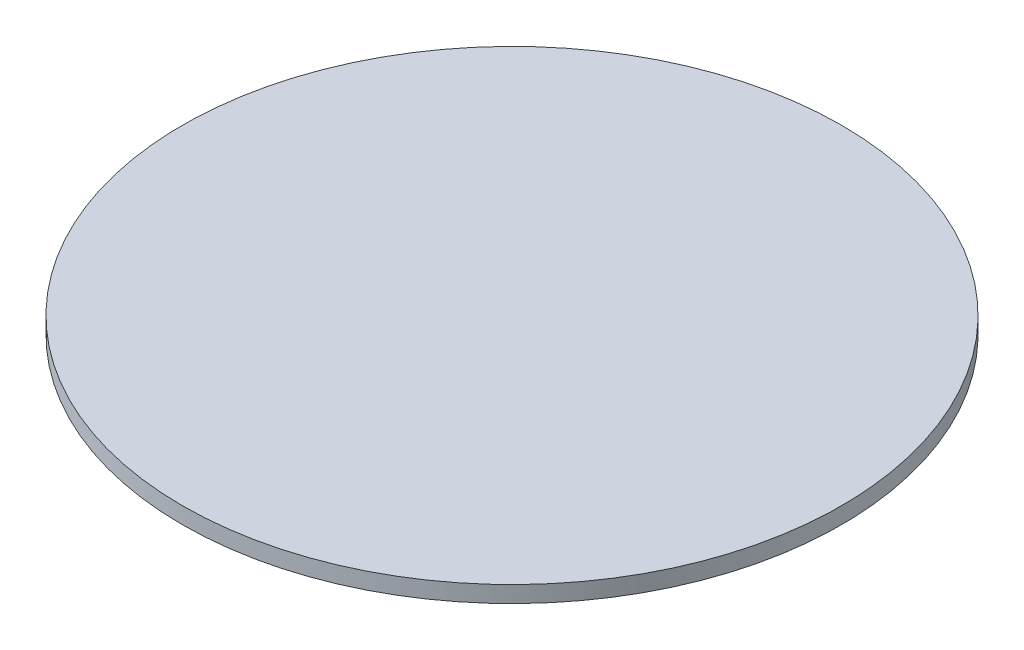
ISO-10303-21;
HEADER;
FILE_DESCRIPTION(('STEP AP214'),'2;1');
FILE_NAME('part.step','',(''),(''),'','','');
FILE_SCHEMA(('AUTOMOTIVE_DESIGN { 1 0 10303 214 1 1 1 1 }'));
ENDSEC;
DATA;
#1=APPLICATION_CONTEXT('core data for automotive mechanical design processes');
#2=APPLICATION_PROTOCOL_DEFINITION('international standard','automotive_design',2000,#1);
#3=PRODUCT_CONTEXT('',#1,'mechanical');
#4=PRODUCT('Part','Part','',(#3));
#5=PRODUCT_RELATED_PRODUCT_CATEGORY('part','',(#4));
#6=PRODUCT_DEFINITION_FORMATION('','',#4);
#7=PRODUCT_DEFINITION_CONTEXT('part definition',#1,'design');
#8=PRODUCT_DEFINITION('design','',#6,#7);
#9=PRODUCT_DEFINITION_SHAPE('','',#8);
#10=(LENGTH_UNIT() NAMED_UNIT(*) SI_UNIT(.MILLI.,.METRE.));
#11=(NAMED_UNIT(*) PLANE_ANGLE_UNIT() SI_UNIT($,.RADIAN.));
#12=(NAMED_UNIT(*) SI_UNIT($,.STERADIAN.) SOLID_ANGLE_UNIT());
#13=UNCERTAINTY_MEASURE_WITH_UNIT(LENGTH_MEASURE(1.E-05),#10,'distance_accuracy_value','');
#14=(GEOMETRIC_REPRESENTATION_CONTEXT(3) GLOBAL_UNCERTAINTY_ASSIGNED_CONTEXT((#13)) GLOBAL_UNIT_ASSIGNED_CONTEXT((#10,
#11,#12)) REPRESENTATION_CONTEXT('',''));
#15=CARTESIAN_POINT('',(0.,0.,0.));
#16=DIRECTION('',(0.,0.,1.));
#17=DIRECTION('',(1.,0.,0.));
#18=AXIS2_PLACEMENT_3D('',#15,#16,#17);
#19=CARTESIAN_POINT('',(0.,5.,0.));
#20=DIRECTION('',(0.,-1.,0.));
#21=DIRECTION('',(0.,0.,-1.));
#22=AXIS2_PLACEMENT_3D('',#19,#20,#21);
#23=CYLINDRICAL_SURFACE('',#22,100.);
#24=CARTESIAN_POINT('',(0.,5.,0.));
#25=DIRECTION('',(0.,1.,0.));
#26=DIRECTION('',(0.,0.,1.));
#27=AXIS2_PLACEMENT_3D('',#24,#25,#26);
#28=CIRCLE('',#27,100.);
#29=CARTESIAN_POINT('',(0.,5.,100.));
#30=VERTEX_POINT('',#29);
#31=EDGE_CURVE('E10',#30,#30,#28,.T.);
#32=ORIENTED_EDGE('',*,*,#31,.F.);
#33=EDGE_LOOP('',(#32));
#34=FACE_BOUND('',#33,.T.);
#35=CARTESIAN_POINT('',(0.,0.,0.));
#36=DIRECTION('',(0.,1.,0.));
#37=DIRECTION('',(0.,0.,1.));
#38=AXIS2_PLACEMENT_3D('',#35,#36,#37);
#39=CIRCLE('',#38,100.);
#40=CARTESIAN_POINT('',(0.,0.,100.));
#41=VERTEX_POINT('',#40);
#42=EDGE_CURVE('E45',#41,#41,#39,.T.);
#43=ORIENTED_EDGE('',*,*,#42,.T.);
#44=EDGE_LOOP('',(#43));
#45=FACE_BOUND('',#44,.T.);
#46=ADVANCED_FACE('F42',(#34,#45),#23,.T.);
#47=CARTESIAN_POINT('',(0.,5.,0.));
#48=DIRECTION('',(0.,1.,0.));
#49=DIRECTION('',(0.,0.,1.));
#50=AXIS2_PLACEMENT_3D('',#47,#48,#49);
#51=PLANE('',#50);
#52=ORIENTED_EDGE('',*,*,#31,.T.);
#53=EDGE_LOOP('',(#52));
#54=FACE_BOUND('',#53,.T.);
#55=ADVANCED_FACE('F59',(#54),#51,.T.);
#56=CARTESIAN_POINT('',(0.,0.,0.));
#57=DIRECTION('',(0.,1.,0.));
#58=DIRECTION('',(0.,0.,1.));
#59=AXIS2_PLACEMENT_3D('',#56,#57,#58);
#60=PLANE('',#59);
#61=ORIENTED_EDGE('',*,*,#42,.F.);
#62=EDGE_LOOP('',(#61));
#63=FACE_BOUND('',#62,.T.);
#64=ADVANCED_FACE('F57',(#63),#60,.F.);
#65=CLOSED_SHELL('',(#46,#55,#64));
#66=MANIFOLD_SOLID_BREP('B2',#65);
#67=ADVANCED_BREP_SHAPE_REPRESENTATION('',(#18,#66),#14);
#68=SHAPE_DEFINITION_REPRESENTATION(#9,#67);
ENDSEC;
END-ISO-10303-21;
